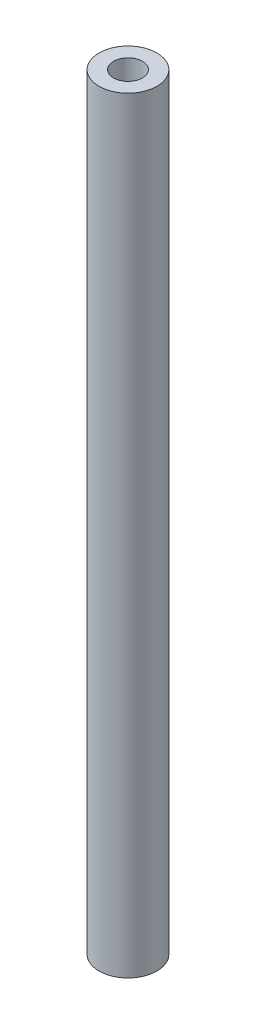
ISO-10303-21;
HEADER;
FILE_DESCRIPTION(('STEP AP214'),'2;1');
FILE_NAME('part.step','',(''),(''),'','','');
FILE_SCHEMA(('AUTOMOTIVE_DESIGN { 1 0 10303 214 1 1 1 1 }'));
ENDSEC;
DATA;
#1=APPLICATION_CONTEXT('core data for automotive mechanical design processes');
#2=APPLICATION_PROTOCOL_DEFINITION('international standard','automotive_design',2000,#1);
#3=PRODUCT_CONTEXT('',#1,'mechanical');
#4=PRODUCT('Part','Part','',(#3));
#5=PRODUCT_RELATED_PRODUCT_CATEGORY('part','',(#4));
#6=PRODUCT_DEFINITION_FORMATION('','',#4);
#7=PRODUCT_DEFINITION_CONTEXT('part definition',#1,'design');
#8=PRODUCT_DEFINITION('design','',#6,#7);
#9=PRODUCT_DEFINITION_SHAPE('','',#8);
#10=(LENGTH_UNIT() NAMED_UNIT(*) SI_UNIT(.MILLI.,.METRE.));
#11=(NAMED_UNIT(*) PLANE_ANGLE_UNIT() SI_UNIT($,.RADIAN.));
#12=(NAMED_UNIT(*) SI_UNIT($,.STERADIAN.) SOLID_ANGLE_UNIT());
#13=UNCERTAINTY_MEASURE_WITH_UNIT(LENGTH_MEASURE(1.E-05),#10,'distance_accuracy_value','');
#14=(GEOMETRIC_REPRESENTATION_CONTEXT(3) GLOBAL_UNCERTAINTY_ASSIGNED_CONTEXT((#13)) GLOBAL_UNIT_ASSIGNED_CONTEXT((#10,
#11,#12)) REPRESENTATION_CONTEXT('',''));
#15=CARTESIAN_POINT('',(0.,0.,0.));
#16=DIRECTION('',(0.,0.,1.));
#17=DIRECTION('',(1.,0.,0.));
#18=AXIS2_PLACEMENT_3D('',#15,#16,#17);
#19=CARTESIAN_POINT('',(0.,53.,0.));
#20=DIRECTION('',(0.,1.,0.));
#21=DIRECTION('',(0.,0.,1.));
#22=AXIS2_PLACEMENT_3D('',#19,#20,#21);
#23=PLANE('',#22);
#24=CARTESIAN_POINT('',(0.,53.,0.));
#25=DIRECTION('',(0.,1.,0.));
#26=DIRECTION('',(0.,0.,1.));
#27=AXIS2_PLACEMENT_3D('',#24,#25,#26);
#28=CIRCLE('',#27,2.);
#29=CARTESIAN_POINT('',(0.,53.,2.));
#30=VERTEX_POINT('',#29);
#31=EDGE_CURVE('E10',#30,#30,#28,.T.);
#32=ORIENTED_EDGE('',*,*,#31,.T.);
#33=EDGE_LOOP('',(#32));
#34=FACE_BOUND('',#33,.T.);
#35=CARTESIAN_POINT('',(0.,53.,0.));
#36=DIRECTION('',(0.,1.,0.));
#37=DIRECTION('',(0.,0.,1.));
#38=AXIS2_PLACEMENT_3D('',#35,#36,#37);
#39=CIRCLE('',#38,1.);
#40=CARTESIAN_POINT('',(0.,53.,1.));
#41=VERTEX_POINT('',#40);
#42=EDGE_CURVE('E41',#41,#41,#39,.T.);
#43=ORIENTED_EDGE('',*,*,#42,.F.);
#44=EDGE_LOOP('',(#43));
#45=FACE_BOUND('',#44,.T.);
#46=ADVANCED_FACE('F30',(#34,#45),#23,.T.);
#47=CARTESIAN_POINT('',(0.,0.,0.));
#48=DIRECTION('',(0.,1.,0.));
#49=DIRECTION('',(0.,0.,1.));
#50=AXIS2_PLACEMENT_3D('',#47,#48,#49);
#51=PLANE('',#50);
#52=CARTESIAN_POINT('',(0.,0.,0.));
#53=DIRECTION('',(0.,1.,0.));
#54=DIRECTION('',(0.,0.,1.));
#55=AXIS2_PLACEMENT_3D('',#52,#53,#54);
#56=CIRCLE('',#55,2.);
#57=CARTESIAN_POINT('',(0.,0.,2.));
#58=VERTEX_POINT('',#57);
#59=EDGE_CURVE('E34',#58,#58,#56,.T.);
#60=ORIENTED_EDGE('',*,*,#59,.F.);
#61=EDGE_LOOP('',(#60));
#62=FACE_BOUND('',#61,.T.);
#63=CARTESIAN_POINT('',(0.,0.,0.));
#64=DIRECTION('',(0.,1.,0.));
#65=DIRECTION('',(0.,0.,1.));
#66=AXIS2_PLACEMENT_3D('',#63,#64,#65);
#67=CIRCLE('',#66,1.);
#68=CARTESIAN_POINT('',(0.,0.,1.));
#69=VERTEX_POINT('',#68);
#70=EDGE_CURVE('E43',#69,#69,#67,.T.);
#71=ORIENTED_EDGE('',*,*,#70,.T.);
#72=EDGE_LOOP('',(#71));
#73=FACE_BOUND('',#72,.T.);
#74=ADVANCED_FACE('F53',(#62,#73),#51,.F.);
#75=CARTESIAN_POINT('',(0.,53.,0.));
#76=DIRECTION('',(0.,-1.,0.));
#77=DIRECTION('',(0.,0.,-1.));
#78=AXIS2_PLACEMENT_3D('',#75,#76,#77);
#79=CYLINDRICAL_SURFACE('',#78,2.);
#80=ORIENTED_EDGE('',*,*,#31,.F.);
#81=EDGE_LOOP('',(#80));
#82=FACE_BOUND('',#81,.T.);
#83=ORIENTED_EDGE('',*,*,#59,.T.);
#84=EDGE_LOOP('',(#83));
#85=FACE_BOUND('',#84,.T.);
#86=ADVANCED_FACE('F32',(#82,#85),#79,.T.);
#87=CARTESIAN_POINT('',(0.,53.,0.));
#88=DIRECTION('',(0.,-1.,0.));
#89=DIRECTION('',(0.,0.,-1.));
#90=AXIS2_PLACEMENT_3D('',#87,#88,#89);
#91=CYLINDRICAL_SURFACE('',#90,1.);
#92=ORIENTED_EDGE('',*,*,#42,.T.);
#93=EDGE_LOOP('',(#92));
#94=FACE_BOUND('',#93,.T.);
#95=ORIENTED_EDGE('',*,*,#70,.F.);
#96=EDGE_LOOP('',(#95));
#97=FACE_BOUND('',#96,.T.);
#98=ADVANCED_FACE('F49',(#94,#97),#91,.F.);
#99=CLOSED_SHELL('',(#46,#74,#86,#98));
#100=MANIFOLD_SOLID_BREP('B2',#99);
#101=ADVANCED_BREP_SHAPE_REPRESENTATION('',(#18,#100),#14);
#102=SHAPE_DEFINITION_REPRESENTATION(#9,#101);
ENDSEC;
END-ISO-10303-21;
